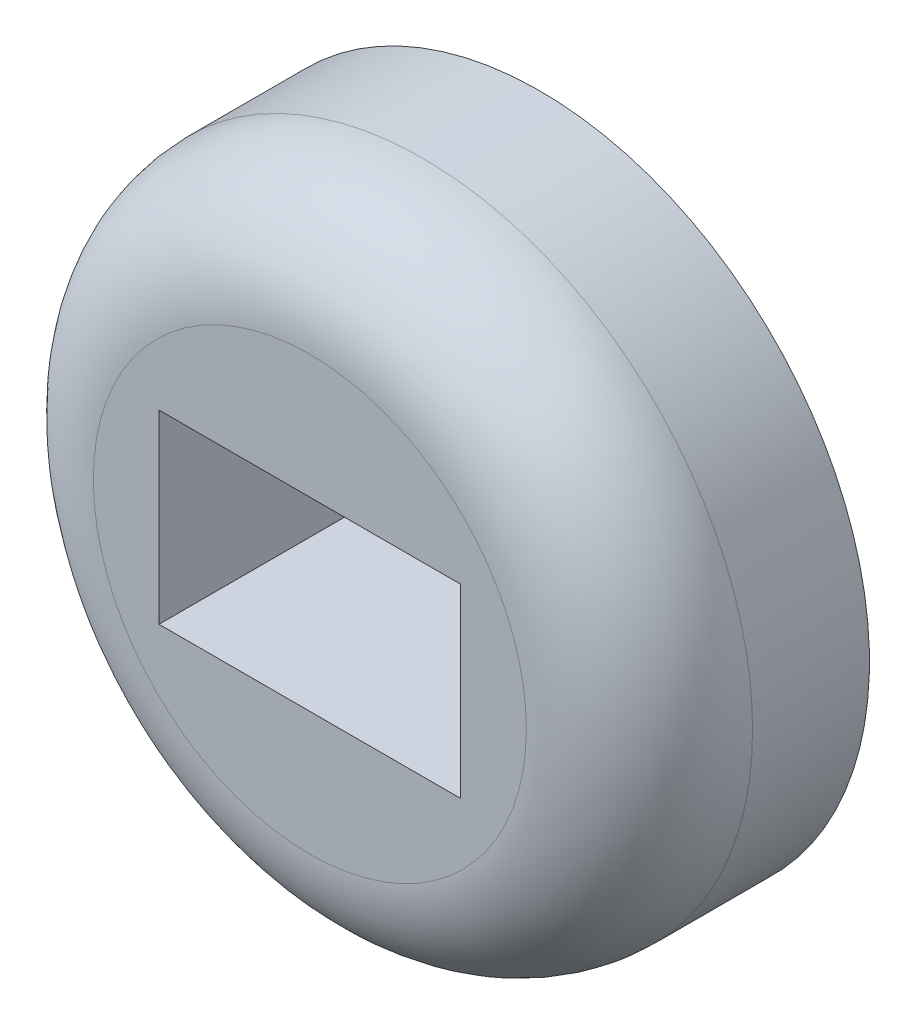
ISO-10303-21;
HEADER;
FILE_DESCRIPTION(('STEP AP214'),'2;1');
FILE_NAME('part.step','',(''),(''),'','','');
FILE_SCHEMA(('AUTOMOTIVE_DESIGN { 1 0 10303 214 1 1 1 1 }'));
ENDSEC;
DATA;
#1=APPLICATION_CONTEXT('core data for automotive mechanical design processes');
#2=APPLICATION_PROTOCOL_DEFINITION('international standard','automotive_design',2000,#1);
#3=PRODUCT_CONTEXT('',#1,'mechanical');
#4=PRODUCT('Part','Part','',(#3));
#5=PRODUCT_RELATED_PRODUCT_CATEGORY('part','',(#4));
#6=PRODUCT_DEFINITION_FORMATION('','',#4);
#7=PRODUCT_DEFINITION_CONTEXT('part definition',#1,'design');
#8=PRODUCT_DEFINITION('design','',#6,#7);
#9=PRODUCT_DEFINITION_SHAPE('','',#8);
#10=(LENGTH_UNIT() NAMED_UNIT(*) SI_UNIT(.MILLI.,.METRE.));
#11=(NAMED_UNIT(*) PLANE_ANGLE_UNIT() SI_UNIT($,.RADIAN.));
#12=(NAMED_UNIT(*) SI_UNIT($,.STERADIAN.) SOLID_ANGLE_UNIT());
#13=UNCERTAINTY_MEASURE_WITH_UNIT(LENGTH_MEASURE(1.E-05),#10,'distance_accuracy_value','');
#14=(GEOMETRIC_REPRESENTATION_CONTEXT(3) GLOBAL_UNCERTAINTY_ASSIGNED_CONTEXT((#13)) GLOBAL_UNIT_ASSIGNED_CONTEXT((#10,
#11,#12)) REPRESENTATION_CONTEXT('',''));
#15=CARTESIAN_POINT('',(0.,0.,0.));
#16=DIRECTION('',(0.,0.,1.));
#17=DIRECTION('',(1.,0.,0.));
#18=AXIS2_PLACEMENT_3D('',#15,#16,#17);
#19=CARTESIAN_POINT('',(0.,0.,61.));
#20=DIRECTION('',(0.,0.,-1.));
#21=DIRECTION('',(-1.,0.,0.));
#22=AXIS2_PLACEMENT_3D('',#19,#20,#21);
#23=CYLINDRICAL_SURFACE('',#22,87.4196090766216);
#24=CARTESIAN_POINT('',(0.,0.,31.));
#25=DIRECTION('',(0.,0.,1.));
#26=DIRECTION('',(1.,0.,0.));
#27=AXIS2_PLACEMENT_3D('',#24,#25,#26);
#28=CIRCLE('',#27,87.4196090766216);
#29=CARTESIAN_POINT('',(-87.4196090766216,0.,31.));
#30=VERTEX_POINT('',#29);
#31=EDGE_CURVE('E11',#30,#30,#28,.F.);
#32=CARTESIAN_POINT('',(0.,0.,0.));
#33=DIRECTION('',(0.,0.,1.));
#34=DIRECTION('',(1.,0.,0.));
#35=AXIS2_PLACEMENT_3D('',#32,#33,#34);
#36=CIRCLE('',#35,87.4196090766216);
#37=CARTESIAN_POINT('',(-87.4196090766216,0.,0.));
#38=VERTEX_POINT('',#37);
#39=EDGE_CURVE('E110',#38,#38,#36,.T.);
#40=CARTESIAN_POINT('',(-87.4196090766216,0.,31.));
#41=CARTESIAN_POINT('',(-87.4196090766216,0.,30.6770833333334));
#42=CARTESIAN_POINT('',(-87.4196090766216,0.,30.3541666666667));
#43=CARTESIAN_POINT('',(-87.4196090766216,0.,29.7083333333334));
#44=CARTESIAN_POINT('',(-87.4196090766216,0.,29.3854166666667));
#45=CARTESIAN_POINT('',(-87.4196090766216,0.,28.7395833333334));
#46=CARTESIAN_POINT('',(-87.4196090766216,0.,28.4166666666667));
#47=CARTESIAN_POINT('',(-87.4196090766216,0.,27.7708333333334));
#48=CARTESIAN_POINT('',(-87.4196090766216,0.,27.4479166666667));
#49=CARTESIAN_POINT('',(-87.4196090766216,0.,26.8020833333334));
#50=CARTESIAN_POINT('',(-87.4196090766216,0.,26.4791666666667));
#51=CARTESIAN_POINT('',(-87.4196090766216,0.,25.8333333333334));
#52=CARTESIAN_POINT('',(-87.4196090766216,0.,25.5104166666667));
#53=CARTESIAN_POINT('',(-87.4196090766216,0.,24.8645833333334));
#54=CARTESIAN_POINT('',(-87.4196090766216,0.,24.5416666666667));
#55=CARTESIAN_POINT('',(-87.4196090766216,0.,23.8958333333334));
#56=CARTESIAN_POINT('',(-87.4196090766216,0.,23.5729166666667));
#57=CARTESIAN_POINT('',(-87.4196090766216,0.,22.9270833333333));
#58=CARTESIAN_POINT('',(-87.4196090766216,0.,22.6041666666667));
#59=CARTESIAN_POINT('',(-87.4196090766216,0.,21.9583333333333));
#60=CARTESIAN_POINT('',(-87.4196090766216,0.,21.6354166666667));
#61=CARTESIAN_POINT('',(-87.4196090766216,0.,20.9895833333333));
#62=CARTESIAN_POINT('',(-87.4196090766216,0.,20.6666666666667));
#63=CARTESIAN_POINT('',(-87.4196090766216,0.,20.0208333333333));
#64=CARTESIAN_POINT('',(-87.4196090766216,0.,19.6979166666667));
#65=CARTESIAN_POINT('',(-87.4196090766216,0.,19.0520833333333));
#66=CARTESIAN_POINT('',(-87.4196090766216,0.,18.7291666666667));
#67=CARTESIAN_POINT('',(-87.4196090766216,0.,18.0833333333333));
#68=CARTESIAN_POINT('',(-87.4196090766216,0.,17.7604166666667));
#69=CARTESIAN_POINT('',(-87.4196090766216,0.,17.1145833333333));
#70=CARTESIAN_POINT('',(-87.4196090766216,0.,16.7916666666667));
#71=CARTESIAN_POINT('',(-87.4196090766216,0.,16.1458333333333));
#72=CARTESIAN_POINT('',(-87.4196090766216,0.,15.8229166666667));
#73=CARTESIAN_POINT('',(-87.4196090766216,0.,15.1770833333333));
#74=CARTESIAN_POINT('',(-87.4196090766216,0.,14.8541666666667));
#75=CARTESIAN_POINT('',(-87.4196090766216,0.,14.2083333333333));
#76=CARTESIAN_POINT('',(-87.4196090766216,0.,13.8854166666667));
#77=CARTESIAN_POINT('',(-87.4196090766216,0.,13.2395833333333));
#78=CARTESIAN_POINT('',(-87.4196090766216,0.,12.9166666666667));
#79=CARTESIAN_POINT('',(-87.4196090766216,0.,12.2708333333333));
#80=CARTESIAN_POINT('',(-87.4196090766216,0.,11.9479166666667));
#81=CARTESIAN_POINT('',(-87.4196090766216,0.,11.3020833333333));
#82=CARTESIAN_POINT('',(-87.4196090766216,0.,10.9791666666667));
#83=CARTESIAN_POINT('',(-87.4196090766216,0.,10.3333333333333));
#84=CARTESIAN_POINT('',(-87.4196090766216,0.,10.0104166666667));
#85=CARTESIAN_POINT('',(-87.4196090766216,0.,9.36458333333334));
#86=CARTESIAN_POINT('',(-87.4196090766216,0.,9.04166666666667));
#87=CARTESIAN_POINT('',(-87.4196090766216,0.,8.39583333333334));
#88=CARTESIAN_POINT('',(-87.4196090766216,0.,8.07291666666667));
#89=CARTESIAN_POINT('',(-87.4196090766216,0.,7.42708333333333));
#90=CARTESIAN_POINT('',(-87.4196090766216,0.,7.10416666666666));
#91=CARTESIAN_POINT('',(-87.4196090766216,0.,6.45833333333333));
#92=CARTESIAN_POINT('',(-87.4196090766216,0.,6.13541666666666));
#93=CARTESIAN_POINT('',(-87.4196090766216,0.,5.48958333333333));
#94=CARTESIAN_POINT('',(-87.4196090766216,0.,5.16666666666667));
#95=CARTESIAN_POINT('',(-87.4196090766216,0.,4.52083333333333));
#96=CARTESIAN_POINT('',(-87.4196090766216,0.,4.19791666666667));
#97=CARTESIAN_POINT('',(-87.4196090766216,0.,3.55208333333333));
#98=CARTESIAN_POINT('',(-87.4196090766216,0.,3.22916666666666));
#99=CARTESIAN_POINT('',(-87.4196090766216,0.,2.58333333333333));
#100=CARTESIAN_POINT('',(-87.4196090766216,0.,2.26041666666666));
#101=CARTESIAN_POINT('',(-87.4196090766216,0.,1.61458333333333));
#102=CARTESIAN_POINT('',(-87.4196090766216,0.,1.29166666666666));
#103=CARTESIAN_POINT('',(-87.4196090766216,0.,0.645833333333329));
#104=CARTESIAN_POINT('',(-87.4196090766216,0.,0.322916666666661));
#105=CARTESIAN_POINT('',(-87.4196090766216,0.,0.));
#106=B_SPLINE_CURVE_WITH_KNOTS('',3,(#40,#41,#42,#43,#44,#45,#46,#47,#48,#49,#50,#51,#52,#53,
#54,#55,#56,#57,#58,#59,#60,#61,#62,#63,#64,#65,#66,#67,#68,#69,#70,#71,#72,#73,#74,#75,#76,#77,
#78,#79,#80,#81,#82,#83,#84,#85,#86,#87,#88,#89,#90,#91,#92,#93,#94,#95,#96,#97,#98,#99,#100,
#101,#102,#103,#104,#105),.UNSPECIFIED.,.F.,.F.,(4,2,2,2,2,2,2,2,2,2,2,2,2,2,2,2,2,2,2,2,2,2,2,
2,2,2,2,2,2,2,2,2,4),(0.,0.968750000000001,1.9375,2.90625,3.875,4.84375,5.8125,6.78125000000001,
7.75,8.71875000000001,9.68750000000001,10.65625,11.625,12.59375,13.5625,14.53125,15.5,16.46875,
17.4375,18.40625,19.375,20.34375,21.3125,22.28125,23.25,24.21875,25.1875,26.15625,27.125,
28.09375,29.0625,30.03125,31.),.UNSPECIFIED.);
#107=EDGE_CURVE('BSEAM37',#30,#38,#106,.T.);
#108=ORIENTED_EDGE('',*,*,#31,.T.);
#109=ORIENTED_EDGE('',*,*,#39,.T.);
#110=ORIENTED_EDGE('',*,*,#107,.T.);
#111=ORIENTED_EDGE('',*,*,#107,.F.);
#112=EDGE_LOOP('',(#108,#110,#109,#111));
#113=FACE_BOUND('',#112,.T.);
#114=ADVANCED_FACE('F37',(#113),#23,.T.);
#115=CARTESIAN_POINT('',(0.,0.,61.));
#116=DIRECTION('',(0.,0.,1.));
#117=DIRECTION('',(1.,0.,0.));
#118=AXIS2_PLACEMENT_3D('',#115,#116,#117);
#119=PLANE('',#118);
#120=DIRECTION('',(1.,0.,0.));
#121=VECTOR('',#120,1.);
#122=CARTESIAN_POINT('',(-40.,-24.6,61.));
#123=LINE('',#122,#121);
#124=CARTESIAN_POINT('',(-40.,-24.6,61.));
#125=VERTEX_POINT('',#124);
#126=CARTESIAN_POINT('',(40.,-24.6,61.));
#127=VERTEX_POINT('',#126);
#128=EDGE_CURVE('E52',#125,#127,#123,.T.);
#129=ORIENTED_EDGE('',*,*,#128,.F.);
#130=DIRECTION('',(0.,-1.,0.));
#131=VECTOR('',#130,1.);
#132=CARTESIAN_POINT('',(-40.,24.6,61.));
#133=LINE('',#132,#131);
#134=CARTESIAN_POINT('',(-40.,24.6,61.));
#135=VERTEX_POINT('',#134);
#136=EDGE_CURVE('E95',#135,#125,#133,.T.);
#137=ORIENTED_EDGE('',*,*,#136,.F.);
#138=DIRECTION('',(1.,0.,0.));
#139=VECTOR('',#138,1.);
#140=CARTESIAN_POINT('',(-40.,24.6,61.));
#141=LINE('',#140,#139);
#142=CARTESIAN_POINT('',(40.,24.6,61.));
#143=VERTEX_POINT('',#142);
#144=EDGE_CURVE('E98',#135,#143,#141,.T.);
#145=ORIENTED_EDGE('',*,*,#144,.T.);
#146=DIRECTION('',(0.,-1.,0.));
#147=VECTOR('',#146,1.);
#148=CARTESIAN_POINT('',(40.,24.6,61.));
#149=LINE('',#148,#147);
#150=EDGE_CURVE('E104',#143,#127,#149,.T.);
#151=ORIENTED_EDGE('',*,*,#150,.T.);
#152=EDGE_LOOP('',(#129,#137,#145,#151));
#153=FACE_BOUND('',#152,.T.);
#154=CARTESIAN_POINT('',(0.,0.,61.));
#155=DIRECTION('',(0.,0.,1.));
#156=DIRECTION('',(1.,0.,0.));
#157=AXIS2_PLACEMENT_3D('',#154,#155,#156);
#158=CIRCLE('',#157,57.4196090766216);
#159=CARTESIAN_POINT('',(57.4196090766216,0.,61.));
#160=VERTEX_POINT('',#159);
#161=EDGE_CURVE('E45',#160,#160,#158,.T.);
#162=ORIENTED_EDGE('',*,*,#161,.T.);
#163=EDGE_LOOP('',(#162));
#164=FACE_BOUND('',#163,.T.);
#165=ADVANCED_FACE('F118',(#153,#164),#119,.T.);
#166=CARTESIAN_POINT('',(0.,0.,0.));
#167=DIRECTION('',(0.,0.,1.));
#168=DIRECTION('',(1.,0.,0.));
#169=AXIS2_PLACEMENT_3D('',#166,#167,#168);
#170=PLANE('',#169);
#171=DIRECTION('',(0.,-1.,0.));
#172=VECTOR('',#171,1.);
#173=CARTESIAN_POINT('',(-40.,24.6,0.));
#174=LINE('',#173,#172);
#175=CARTESIAN_POINT('',(-40.,24.6,0.));
#176=VERTEX_POINT('',#175);
#177=CARTESIAN_POINT('',(-40.,-24.6,0.));
#178=VERTEX_POINT('',#177);
#179=EDGE_CURVE('E90',#176,#178,#174,.T.);
#180=ORIENTED_EDGE('',*,*,#179,.T.);
#181=DIRECTION('',(1.,0.,0.));
#182=VECTOR('',#181,1.);
#183=CARTESIAN_POINT('',(-40.,-24.6,0.));
#184=LINE('',#183,#182);
#185=CARTESIAN_POINT('',(40.,-24.6,0.));
#186=VERTEX_POINT('',#185);
#187=EDGE_CURVE('E85',#178,#186,#184,.T.);
#188=ORIENTED_EDGE('',*,*,#187,.T.);
#189=DIRECTION('',(0.,-1.,0.));
#190=VECTOR('',#189,1.);
#191=CARTESIAN_POINT('',(40.,24.6,0.));
#192=LINE('',#191,#190);
#193=CARTESIAN_POINT('',(40.,24.6,0.));
#194=VERTEX_POINT('',#193);
#195=EDGE_CURVE('E77',#194,#186,#192,.T.);
#196=ORIENTED_EDGE('',*,*,#195,.F.);
#197=DIRECTION('',(1.,0.,0.));
#198=VECTOR('',#197,1.);
#199=CARTESIAN_POINT('',(-40.,24.6,0.));
#200=LINE('',#199,#198);
#201=EDGE_CURVE('E84',#176,#194,#200,.T.);
#202=ORIENTED_EDGE('',*,*,#201,.F.);
#203=EDGE_LOOP('',(#180,#188,#196,#202));
#204=FACE_BOUND('',#203,.T.);
#205=ORIENTED_EDGE('',*,*,#39,.F.);
#206=EDGE_LOOP('',(#205));
#207=FACE_BOUND('',#206,.T.);
#208=ADVANCED_FACE('F92',(#204,#207),#170,.F.);
#209=CARTESIAN_POINT('',(0.,0.,31.));
#210=DIRECTION('',(0.,0.,1.));
#211=DIRECTION('',(1.,0.,0.));
#212=AXIS2_PLACEMENT_3D('',#209,#210,#211);
#213=TOROIDAL_SURFACE('',#212,57.4196090766216,30.);
#214=ORIENTED_EDGE('',*,*,#31,.F.);
#215=EDGE_LOOP('',(#214));
#216=FACE_BOUND('',#215,.T.);
#217=ORIENTED_EDGE('',*,*,#161,.F.);
#218=EDGE_LOOP('',(#217));
#219=FACE_BOUND('',#218,.T.);
#220=ADVANCED_FACE('F39',(#216,#219),#213,.T.);
#221=CARTESIAN_POINT('',(-40.,-24.6,0.));
#222=DIRECTION('',(0.,-1.,0.));
#223=DIRECTION('',(0.,0.,-1.));
#224=AXIS2_PLACEMENT_3D('',#221,#222,#223);
#225=PLANE('',#224);
#226=ORIENTED_EDGE('',*,*,#128,.T.);
#227=DIRECTION('',(0.,0.,1.));
#228=VECTOR('',#227,1.);
#229=CARTESIAN_POINT('',(40.,-24.6,0.));
#230=LINE('',#229,#228);
#231=EDGE_CURVE('E79',#186,#127,#230,.T.);
#232=ORIENTED_EDGE('',*,*,#231,.F.);
#233=ORIENTED_EDGE('',*,*,#187,.F.);
#234=DIRECTION('',(0.,0.,1.));
#235=VECTOR('',#234,1.);
#236=CARTESIAN_POINT('',(-40.,-24.6,0.));
#237=LINE('',#236,#235);
#238=EDGE_CURVE('E108',#178,#125,#237,.T.);
#239=ORIENTED_EDGE('',*,*,#238,.T.);
#240=EDGE_LOOP('',(#226,#232,#233,#239));
#241=FACE_BOUND('',#240,.T.);
#242=ADVANCED_FACE('F88',(#241),#225,.F.);
#243=CARTESIAN_POINT('',(-40.,24.6,0.));
#244=DIRECTION('',(-1.,0.,0.));
#245=DIRECTION('',(0.,-1.,0.));
#246=AXIS2_PLACEMENT_3D('',#243,#244,#245);
#247=PLANE('',#246);
#248=ORIENTED_EDGE('',*,*,#136,.T.);
#249=ORIENTED_EDGE('',*,*,#238,.F.);
#250=ORIENTED_EDGE('',*,*,#179,.F.);
#251=DIRECTION('',(0.,0.,1.));
#252=VECTOR('',#251,1.);
#253=CARTESIAN_POINT('',(-40.,24.6,0.));
#254=LINE('',#253,#252);
#255=EDGE_CURVE('E111',#176,#135,#254,.T.);
#256=ORIENTED_EDGE('',*,*,#255,.T.);
#257=EDGE_LOOP('',(#248,#249,#250,#256));
#258=FACE_BOUND('',#257,.T.);
#259=ADVANCED_FACE('F126',(#258),#247,.F.);
#260=CARTESIAN_POINT('',(-40.,24.6,0.));
#261=DIRECTION('',(0.,-1.,0.));
#262=DIRECTION('',(1.,0.,0.));
#263=AXIS2_PLACEMENT_3D('',#260,#261,#262);
#264=PLANE('',#263);
#265=ORIENTED_EDGE('',*,*,#144,.F.);
#266=ORIENTED_EDGE('',*,*,#255,.F.);
#267=ORIENTED_EDGE('',*,*,#201,.T.);
#268=DIRECTION('',(0.,0.,1.));
#269=VECTOR('',#268,1.);
#270=CARTESIAN_POINT('',(40.,24.6,0.));
#271=LINE('',#270,#269);
#272=EDGE_CURVE('E60',#194,#143,#271,.T.);
#273=ORIENTED_EDGE('',*,*,#272,.T.);
#274=EDGE_LOOP('',(#265,#266,#267,#273));
#275=FACE_BOUND('',#274,.T.);
#276=ADVANCED_FACE('F141',(#275),#264,.T.);
#277=CARTESIAN_POINT('',(40.,24.6,0.));
#278=DIRECTION('',(-1.,0.,0.));
#279=DIRECTION('',(0.,-1.,0.));
#280=AXIS2_PLACEMENT_3D('',#277,#278,#279);
#281=PLANE('',#280);
#282=ORIENTED_EDGE('',*,*,#150,.F.);
#283=ORIENTED_EDGE('',*,*,#272,.F.);
#284=ORIENTED_EDGE('',*,*,#195,.T.);
#285=ORIENTED_EDGE('',*,*,#231,.T.);
#286=EDGE_LOOP('',(#282,#283,#284,#285));
#287=FACE_BOUND('',#286,.T.);
#288=ADVANCED_FACE('F78',(#287),#281,.T.);
#289=CLOSED_SHELL('',(#114,#165,#208,#220,#242,#259,#276,#288));
#290=MANIFOLD_SOLID_BREP('B2',#289);
#291=ADVANCED_BREP_SHAPE_REPRESENTATION('',(#18,#290),#14);
#292=SHAPE_DEFINITION_REPRESENTATION(#9,#291);
ENDSEC;
END-ISO-10303-21;
